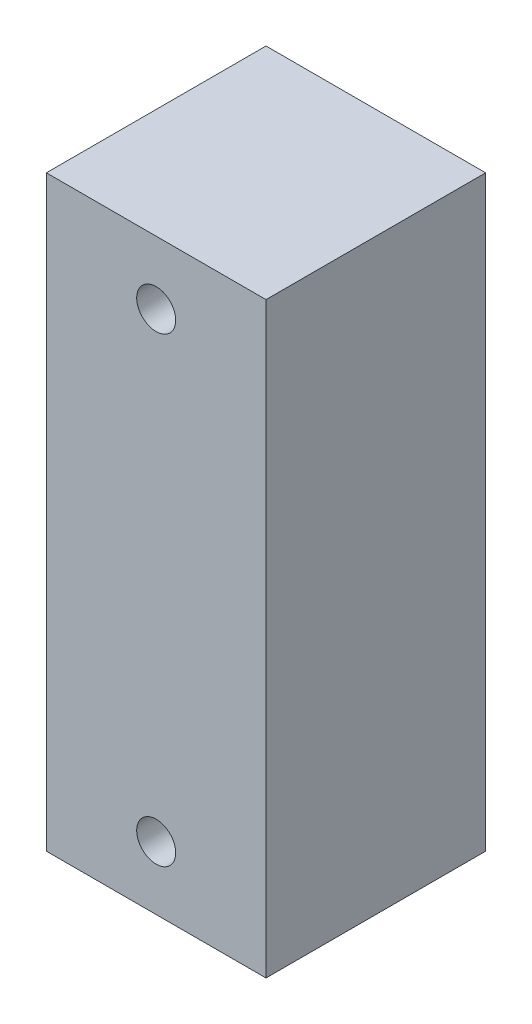
ISO-10303-21;
HEADER;
FILE_DESCRIPTION(('STEP AP214'),'2;1');
FILE_NAME('part.step','',(''),(''),'','','');
FILE_SCHEMA(('AUTOMOTIVE_DESIGN { 1 0 10303 214 1 1 1 1 }'));
ENDSEC;
DATA;
#1=APPLICATION_CONTEXT('core data for automotive mechanical design processes');
#2=APPLICATION_PROTOCOL_DEFINITION('international standard','automotive_design',2000,#1);
#3=PRODUCT_CONTEXT('',#1,'mechanical');
#4=PRODUCT('Part','Part','',(#3));
#5=PRODUCT_RELATED_PRODUCT_CATEGORY('part','',(#4));
#6=PRODUCT_DEFINITION_FORMATION('','',#4);
#7=PRODUCT_DEFINITION_CONTEXT('part definition',#1,'design');
#8=PRODUCT_DEFINITION('design','',#6,#7);
#9=PRODUCT_DEFINITION_SHAPE('','',#8);
#10=(LENGTH_UNIT() NAMED_UNIT(*) SI_UNIT(.MILLI.,.METRE.));
#11=(NAMED_UNIT(*) PLANE_ANGLE_UNIT() SI_UNIT($,.RADIAN.));
#12=(NAMED_UNIT(*) SI_UNIT($,.STERADIAN.) SOLID_ANGLE_UNIT());
#13=UNCERTAINTY_MEASURE_WITH_UNIT(LENGTH_MEASURE(1.E-05),#10,'distance_accuracy_value','');
#14=(GEOMETRIC_REPRESENTATION_CONTEXT(3) GLOBAL_UNCERTAINTY_ASSIGNED_CONTEXT((#13)) GLOBAL_UNIT_ASSIGNED_CONTEXT((#10,
#11,#12)) REPRESENTATION_CONTEXT('',''));
#15=CARTESIAN_POINT('',(0.,0.,0.));
#16=DIRECTION('',(0.,0.,1.));
#17=DIRECTION('',(1.,0.,0.));
#18=AXIS2_PLACEMENT_3D('',#15,#16,#17);
#19=CARTESIAN_POINT('',(0.,0.,20.));
#20=DIRECTION('',(-1.,0.,0.));
#21=DIRECTION('',(0.,0.,1.));
#22=AXIS2_PLACEMENT_3D('',#19,#20,#21);
#23=PLANE('',#22);
#24=DIRECTION('',(0.,1.,0.));
#25=VECTOR('',#24,1.);
#26=CARTESIAN_POINT('',(0.,0.,0.));
#27=LINE('',#26,#25);
#28=CARTESIAN_POINT('',(0.,-53.5,0.));
#29=VERTEX_POINT('',#28);
#30=CARTESIAN_POINT('',(0.,0.,0.));
#31=VERTEX_POINT('',#30);
#32=EDGE_CURVE('E99',#29,#31,#27,.T.);
#33=ORIENTED_EDGE('',*,*,#32,.T.);
#34=DIRECTION('',(0.,0.,-1.));
#35=VECTOR('',#34,1.);
#36=CARTESIAN_POINT('',(0.,0.,20.));
#37=LINE('',#36,#35);
#38=CARTESIAN_POINT('',(0.,0.,20.));
#39=VERTEX_POINT('',#38);
#40=EDGE_CURVE('E11',#39,#31,#37,.T.);
#41=ORIENTED_EDGE('',*,*,#40,.F.);
#42=DIRECTION('',(0.,1.,0.));
#43=VECTOR('',#42,1.);
#44=CARTESIAN_POINT('',(0.,0.,20.));
#45=LINE('',#44,#43);
#46=CARTESIAN_POINT('',(0.,-53.5,20.));
#47=VERTEX_POINT('',#46);
#48=EDGE_CURVE('E86',#47,#39,#45,.T.);
#49=ORIENTED_EDGE('',*,*,#48,.F.);
#50=DIRECTION('',(0.,0.,-1.));
#51=VECTOR('',#50,1.);
#52=CARTESIAN_POINT('',(0.,-53.5,20.));
#53=LINE('',#52,#51);
#54=EDGE_CURVE('E95',#47,#29,#53,.T.);
#55=ORIENTED_EDGE('',*,*,#54,.T.);
#56=EDGE_LOOP('',(#33,#41,#49,#55));
#57=FACE_BOUND('',#56,.T.);
#58=ADVANCED_FACE('F33',(#57),#23,.F.);
#59=CARTESIAN_POINT('',(0.,0.,20.));
#60=DIRECTION('',(0.,-1.,0.));
#61=DIRECTION('',(1.,0.,0.));
#62=AXIS2_PLACEMENT_3D('',#59,#60,#61);
#63=PLANE('',#62);
#64=DIRECTION('',(-1.,0.,0.));
#65=VECTOR('',#64,1.);
#66=CARTESIAN_POINT('',(0.,0.,0.));
#67=LINE('',#66,#65);
#68=CARTESIAN_POINT('',(-20.,0.,0.));
#69=VERTEX_POINT('',#68);
#70=EDGE_CURVE('E90',#31,#69,#67,.T.);
#71=ORIENTED_EDGE('',*,*,#70,.T.);
#72=DIRECTION('',(0.,0.,-1.));
#73=VECTOR('',#72,1.);
#74=CARTESIAN_POINT('',(-20.,0.,20.));
#75=LINE('',#74,#73);
#76=CARTESIAN_POINT('',(-20.,0.,20.));
#77=VERTEX_POINT('',#76);
#78=EDGE_CURVE('E42',#77,#69,#75,.T.);
#79=ORIENTED_EDGE('',*,*,#78,.F.);
#80=DIRECTION('',(-1.,0.,0.));
#81=VECTOR('',#80,1.);
#82=CARTESIAN_POINT('',(0.,0.,20.));
#83=LINE('',#82,#81);
#84=EDGE_CURVE('E81',#39,#77,#83,.T.);
#85=ORIENTED_EDGE('',*,*,#84,.F.);
#86=ORIENTED_EDGE('',*,*,#40,.T.);
#87=EDGE_LOOP('',(#71,#79,#85,#86));
#88=FACE_BOUND('',#87,.T.);
#89=ADVANCED_FACE('F89',(#88),#63,.F.);
#90=CARTESIAN_POINT('',(-20.,0.,20.));
#91=DIRECTION('',(1.,0.,0.));
#92=DIRECTION('',(0.,1.,0.));
#93=AXIS2_PLACEMENT_3D('',#90,#91,#92);
#94=PLANE('',#93);
#95=DIRECTION('',(0.,-1.,0.));
#96=VECTOR('',#95,1.);
#97=CARTESIAN_POINT('',(-20.,0.,0.));
#98=LINE('',#97,#96);
#99=CARTESIAN_POINT('',(-20.,-53.5,0.));
#100=VERTEX_POINT('',#99);
#101=EDGE_CURVE('E68',#69,#100,#98,.T.);
#102=ORIENTED_EDGE('',*,*,#101,.T.);
#103=DIRECTION('',(0.,0.,-1.));
#104=VECTOR('',#103,1.);
#105=CARTESIAN_POINT('',(-20.,-53.5,20.));
#106=LINE('',#105,#104);
#107=CARTESIAN_POINT('',(-20.,-53.5,20.));
#108=VERTEX_POINT('',#107);
#109=EDGE_CURVE('E91',#108,#100,#106,.T.);
#110=ORIENTED_EDGE('',*,*,#109,.F.);
#111=DIRECTION('',(0.,-1.,0.));
#112=VECTOR('',#111,1.);
#113=CARTESIAN_POINT('',(-20.,0.,20.));
#114=LINE('',#113,#112);
#115=EDGE_CURVE('E84',#77,#108,#114,.T.);
#116=ORIENTED_EDGE('',*,*,#115,.F.);
#117=ORIENTED_EDGE('',*,*,#78,.T.);
#118=EDGE_LOOP('',(#102,#110,#116,#117));
#119=FACE_BOUND('',#118,.T.);
#120=ADVANCED_FACE('F93',(#119),#94,.F.);
#121=CARTESIAN_POINT('',(0.,-53.5,20.));
#122=DIRECTION('',(0.,1.,0.));
#123=DIRECTION('',(0.,0.,1.));
#124=AXIS2_PLACEMENT_3D('',#121,#122,#123);
#125=PLANE('',#124);
#126=DIRECTION('',(1.,0.,0.));
#127=VECTOR('',#126,1.);
#128=CARTESIAN_POINT('',(0.,-53.5,0.));
#129=LINE('',#128,#127);
#130=EDGE_CURVE('E74',#100,#29,#129,.T.);
#131=ORIENTED_EDGE('',*,*,#130,.T.);
#132=ORIENTED_EDGE('',*,*,#54,.F.);
#133=DIRECTION('',(1.,0.,0.));
#134=VECTOR('',#133,1.);
#135=CARTESIAN_POINT('',(0.,-53.5,20.));
#136=LINE('',#135,#134);
#137=EDGE_CURVE('E51',#108,#47,#136,.T.);
#138=ORIENTED_EDGE('',*,*,#137,.F.);
#139=ORIENTED_EDGE('',*,*,#109,.T.);
#140=EDGE_LOOP('',(#131,#132,#138,#139));
#141=FACE_BOUND('',#140,.T.);
#142=ADVANCED_FACE('F126',(#141),#125,.F.);
#143=CARTESIAN_POINT('',(0.,0.,20.));
#144=DIRECTION('',(0.,0.,-1.));
#145=DIRECTION('',(-1.,0.,0.));
#146=AXIS2_PLACEMENT_3D('',#143,#144,#145);
#147=PLANE('',#146);
#148=CARTESIAN_POINT('',(-10.,-47.75,20.));
#149=DIRECTION('',(0.,0.,1.));
#150=DIRECTION('',(1.,0.,0.));
#151=AXIS2_PLACEMENT_3D('',#148,#149,#150);
#152=CIRCLE('',#151,1.775);
#153=CARTESIAN_POINT('',(-8.225,-47.75,20.));
#154=VERTEX_POINT('',#153);
#155=EDGE_CURVE('E116',#154,#154,#152,.T.);
#156=ORIENTED_EDGE('',*,*,#155,.F.);
#157=EDGE_LOOP('',(#156));
#158=FACE_BOUND('',#157,.T.);
#159=CARTESIAN_POINT('',(-10.,-5.75,20.));
#160=DIRECTION('',(0.,0.,1.));
#161=DIRECTION('',(1.,0.,0.));
#162=AXIS2_PLACEMENT_3D('',#159,#160,#161);
#163=CIRCLE('',#162,1.775);
#164=CARTESIAN_POINT('',(-8.225,-5.75,20.));
#165=VERTEX_POINT('',#164);
#166=EDGE_CURVE('E108',#165,#165,#163,.T.);
#167=ORIENTED_EDGE('',*,*,#166,.F.);
#168=EDGE_LOOP('',(#167));
#169=FACE_BOUND('',#168,.T.);
#170=ORIENTED_EDGE('',*,*,#48,.T.);
#171=ORIENTED_EDGE('',*,*,#84,.T.);
#172=ORIENTED_EDGE('',*,*,#115,.T.);
#173=ORIENTED_EDGE('',*,*,#137,.T.);
#174=EDGE_LOOP('',(#170,#171,#172,#173));
#175=FACE_BOUND('',#174,.T.);
#176=ADVANCED_FACE('F82',(#158,#169,#175),#147,.F.);
#177=CARTESIAN_POINT('',(0.,0.,0.));
#178=DIRECTION('',(0.,0.,-1.));
#179=DIRECTION('',(-1.,0.,0.));
#180=AXIS2_PLACEMENT_3D('',#177,#178,#179);
#181=PLANE('',#180);
#182=CARTESIAN_POINT('',(-10.,-47.75,0.));
#183=DIRECTION('',(0.,0.,-1.));
#184=DIRECTION('',(-1.,0.,0.));
#185=AXIS2_PLACEMENT_3D('',#182,#183,#184);
#186=CIRCLE('',#185,1.775);
#187=CARTESIAN_POINT('',(-11.775,-47.75,0.));
#188=VERTEX_POINT('',#187);
#189=EDGE_CURVE('E36',#188,#188,#186,.T.);
#190=ORIENTED_EDGE('',*,*,#189,.F.);
#191=EDGE_LOOP('',(#190));
#192=FACE_BOUND('',#191,.T.);
#193=CARTESIAN_POINT('',(-10.,-5.75,0.));
#194=DIRECTION('',(0.,0.,-1.));
#195=DIRECTION('',(-1.,0.,0.));
#196=AXIS2_PLACEMENT_3D('',#193,#194,#195);
#197=CIRCLE('',#196,1.775);
#198=CARTESIAN_POINT('',(-11.775,-5.75,0.));
#199=VERTEX_POINT('',#198);
#200=EDGE_CURVE('E102',#199,#199,#197,.T.);
#201=ORIENTED_EDGE('',*,*,#200,.F.);
#202=EDGE_LOOP('',(#201));
#203=FACE_BOUND('',#202,.T.);
#204=ORIENTED_EDGE('',*,*,#32,.F.);
#205=ORIENTED_EDGE('',*,*,#130,.F.);
#206=ORIENTED_EDGE('',*,*,#101,.F.);
#207=ORIENTED_EDGE('',*,*,#70,.F.);
#208=EDGE_LOOP('',(#204,#205,#206,#207));
#209=FACE_BOUND('',#208,.T.);
#210=ADVANCED_FACE('F125',(#192,#203,#209),#181,.T.);
#211=CARTESIAN_POINT('',(-10.,-5.75,-39.));
#212=DIRECTION('',(0.,0.,1.));
#213=DIRECTION('',(1.,0.,0.));
#214=AXIS2_PLACEMENT_3D('',#211,#212,#213);
#215=CYLINDRICAL_SURFACE('',#214,1.775);
#216=ORIENTED_EDGE('',*,*,#200,.T.);
#217=EDGE_LOOP('',(#216));
#218=FACE_BOUND('',#217,.T.);
#219=ORIENTED_EDGE('',*,*,#166,.T.);
#220=EDGE_LOOP('',(#219));
#221=FACE_BOUND('',#220,.T.);
#222=ADVANCED_FACE('F132',(#218,#221),#215,.F.);
#223=CARTESIAN_POINT('',(-10.,-47.75,-39.));
#224=DIRECTION('',(0.,0.,1.));
#225=DIRECTION('',(1.,0.,0.));
#226=AXIS2_PLACEMENT_3D('',#223,#224,#225);
#227=CYLINDRICAL_SURFACE('',#226,1.775);
#228=ORIENTED_EDGE('',*,*,#189,.T.);
#229=EDGE_LOOP('',(#228));
#230=FACE_BOUND('',#229,.T.);
#231=ORIENTED_EDGE('',*,*,#155,.T.);
#232=EDGE_LOOP('',(#231));
#233=FACE_BOUND('',#232,.T.);
#234=ADVANCED_FACE('F121',(#230,#233),#227,.F.);
#235=CLOSED_SHELL('',(#58,#89,#120,#142,#176,#210,#222,#234));
#236=MANIFOLD_SOLID_BREP('B2',#235);
#237=ADVANCED_BREP_SHAPE_REPRESENTATION('',(#18,#236),#14);
#238=SHAPE_DEFINITION_REPRESENTATION(#9,#237);
ENDSEC;
END-ISO-10303-21;
